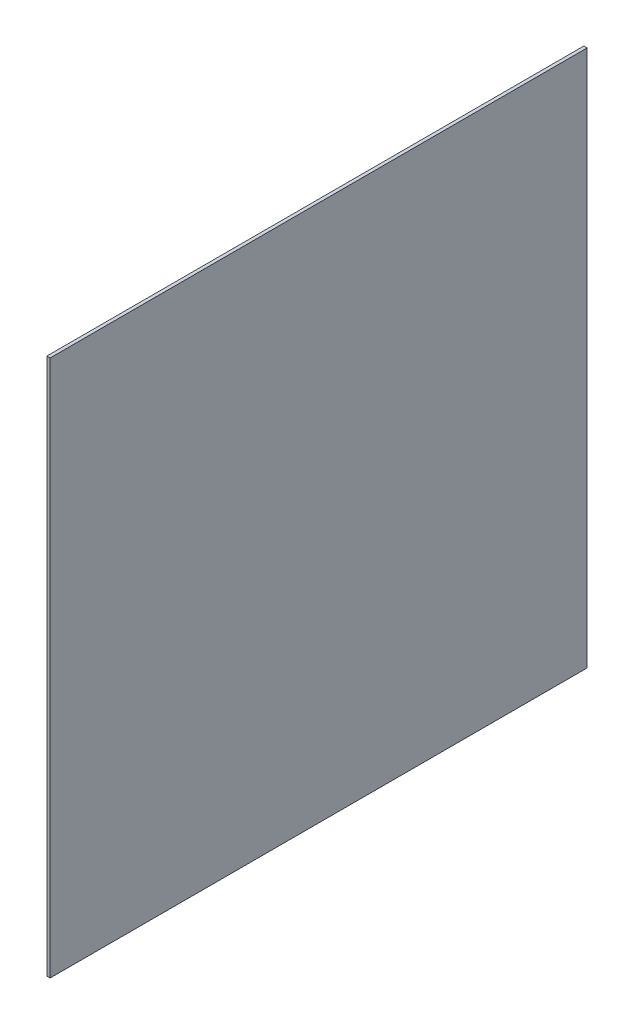
ISO-10303-21;
HEADER;
FILE_DESCRIPTION(('STEP AP214'),'2;1');
FILE_NAME('part.step','',(''),(''),'','','');
FILE_SCHEMA(('AUTOMOTIVE_DESIGN { 1 0 10303 214 1 1 1 1 }'));
ENDSEC;
DATA;
#1=APPLICATION_CONTEXT('core data for automotive mechanical design processes');
#2=APPLICATION_PROTOCOL_DEFINITION('international standard','automotive_design',2000,#1);
#3=PRODUCT_CONTEXT('',#1,'mechanical');
#4=PRODUCT('Part','Part','',(#3));
#5=PRODUCT_RELATED_PRODUCT_CATEGORY('part','',(#4));
#6=PRODUCT_DEFINITION_FORMATION('','',#4);
#7=PRODUCT_DEFINITION_CONTEXT('part definition',#1,'design');
#8=PRODUCT_DEFINITION('design','',#6,#7);
#9=PRODUCT_DEFINITION_SHAPE('','',#8);
#10=(LENGTH_UNIT() NAMED_UNIT(*) SI_UNIT(.MILLI.,.METRE.));
#11=(NAMED_UNIT(*) PLANE_ANGLE_UNIT() SI_UNIT($,.RADIAN.));
#12=(NAMED_UNIT(*) SI_UNIT($,.STERADIAN.) SOLID_ANGLE_UNIT());
#13=UNCERTAINTY_MEASURE_WITH_UNIT(LENGTH_MEASURE(1.E-05),#10,'distance_accuracy_value','');
#14=(GEOMETRIC_REPRESENTATION_CONTEXT(3) GLOBAL_UNCERTAINTY_ASSIGNED_CONTEXT((#13)) GLOBAL_UNIT_ASSIGNED_CONTEXT((#10,
#11,#12)) REPRESENTATION_CONTEXT('',''));
#15=CARTESIAN_POINT('',(0.,0.,0.));
#16=DIRECTION('',(0.,0.,1.));
#17=DIRECTION('',(1.,0.,0.));
#18=AXIS2_PLACEMENT_3D('',#15,#16,#17);
#19=CARTESIAN_POINT('',(0.8,65.4,-65.4));
#20=DIRECTION('',(0.,0.,1.));
#21=DIRECTION('',(1.,0.,0.));
#22=AXIS2_PLACEMENT_3D('',#19,#20,#21);
#23=PLANE('',#22);
#24=DIRECTION('',(0.,1.,0.));
#25=VECTOR('',#24,1.);
#26=CARTESIAN_POINT('',(0.,65.4,-65.4));
#27=LINE('',#26,#25);
#28=CARTESIAN_POINT('',(0.,-65.4,-65.4));
#29=VERTEX_POINT('',#28);
#30=CARTESIAN_POINT('',(0.,65.4,-65.4));
#31=VERTEX_POINT('',#30);
#32=EDGE_CURVE('E96',#29,#31,#27,.T.);
#33=ORIENTED_EDGE('',*,*,#32,.T.);
#34=DIRECTION('',(-1.,0.,0.));
#35=VECTOR('',#34,1.);
#36=CARTESIAN_POINT('',(0.8,65.4,-65.4));
#37=LINE('',#36,#35);
#38=CARTESIAN_POINT('',(0.8,65.4,-65.4));
#39=VERTEX_POINT('',#38);
#40=EDGE_CURVE('E11',#39,#31,#37,.T.);
#41=ORIENTED_EDGE('',*,*,#40,.F.);
#42=DIRECTION('',(0.,1.,0.));
#43=VECTOR('',#42,1.);
#44=CARTESIAN_POINT('',(0.8,65.4,-65.4));
#45=LINE('',#44,#43);
#46=CARTESIAN_POINT('',(0.8,-65.4,-65.4));
#47=VERTEX_POINT('',#46);
#48=EDGE_CURVE('E84',#47,#39,#45,.T.);
#49=ORIENTED_EDGE('',*,*,#48,.F.);
#50=DIRECTION('',(-1.,0.,0.));
#51=VECTOR('',#50,1.);
#52=CARTESIAN_POINT('',(0.8,-65.4,-65.4));
#53=LINE('',#52,#51);
#54=EDGE_CURVE('E92',#47,#29,#53,.T.);
#55=ORIENTED_EDGE('',*,*,#54,.T.);
#56=EDGE_LOOP('',(#33,#41,#49,#55));
#57=FACE_BOUND('',#56,.T.);
#58=ADVANCED_FACE('F33',(#57),#23,.F.);
#59=CARTESIAN_POINT('',(0.8,65.4,65.4));
#60=DIRECTION('',(0.,-1.,0.));
#61=DIRECTION('',(0.,0.,-1.));
#62=AXIS2_PLACEMENT_3D('',#59,#60,#61);
#63=PLANE('',#62);
#64=DIRECTION('',(0.,0.,1.));
#65=VECTOR('',#64,1.);
#66=CARTESIAN_POINT('',(0.,65.4,65.4));
#67=LINE('',#66,#65);
#68=CARTESIAN_POINT('',(0.,65.4,65.4));
#69=VERTEX_POINT('',#68);
#70=EDGE_CURVE('E88',#31,#69,#67,.T.);
#71=ORIENTED_EDGE('',*,*,#70,.T.);
#72=DIRECTION('',(-1.,0.,0.));
#73=VECTOR('',#72,1.);
#74=CARTESIAN_POINT('',(0.8,65.4,65.4));
#75=LINE('',#74,#73);
#76=CARTESIAN_POINT('',(0.8,65.4,65.4));
#77=VERTEX_POINT('',#76);
#78=EDGE_CURVE('E41',#77,#69,#75,.T.);
#79=ORIENTED_EDGE('',*,*,#78,.F.);
#80=DIRECTION('',(0.,0.,1.));
#81=VECTOR('',#80,1.);
#82=CARTESIAN_POINT('',(0.8,65.4,65.4));
#83=LINE('',#82,#81);
#84=EDGE_CURVE('E79',#39,#77,#83,.T.);
#85=ORIENTED_EDGE('',*,*,#84,.F.);
#86=ORIENTED_EDGE('',*,*,#40,.T.);
#87=EDGE_LOOP('',(#71,#79,#85,#86));
#88=FACE_BOUND('',#87,.T.);
#89=ADVANCED_FACE('F87',(#88),#63,.F.);
#90=CARTESIAN_POINT('',(0.8,65.4,65.4));
#91=DIRECTION('',(0.,0.,-1.));
#92=DIRECTION('',(0.,1.,0.));
#93=AXIS2_PLACEMENT_3D('',#90,#91,#92);
#94=PLANE('',#93);
#95=DIRECTION('',(0.,-1.,0.));
#96=VECTOR('',#95,1.);
#97=CARTESIAN_POINT('',(0.,65.4,65.4));
#98=LINE('',#97,#96);
#99=CARTESIAN_POINT('',(0.,-65.4,65.4));
#100=VERTEX_POINT('',#99);
#101=EDGE_CURVE('E66',#69,#100,#98,.T.);
#102=ORIENTED_EDGE('',*,*,#101,.T.);
#103=DIRECTION('',(-1.,0.,0.));
#104=VECTOR('',#103,1.);
#105=CARTESIAN_POINT('',(0.8,-65.4,65.4));
#106=LINE('',#105,#104);
#107=CARTESIAN_POINT('',(0.8,-65.4,65.4));
#108=VERTEX_POINT('',#107);
#109=EDGE_CURVE('E89',#108,#100,#106,.T.);
#110=ORIENTED_EDGE('',*,*,#109,.F.);
#111=DIRECTION('',(0.,-1.,0.));
#112=VECTOR('',#111,1.);
#113=CARTESIAN_POINT('',(0.8,65.4,65.4));
#114=LINE('',#113,#112);
#115=EDGE_CURVE('E82',#77,#108,#114,.T.);
#116=ORIENTED_EDGE('',*,*,#115,.F.);
#117=ORIENTED_EDGE('',*,*,#78,.T.);
#118=EDGE_LOOP('',(#102,#110,#116,#117));
#119=FACE_BOUND('',#118,.T.);
#120=ADVANCED_FACE('F90',(#119),#94,.F.);
#121=CARTESIAN_POINT('',(0.8,-65.4,65.4));
#122=DIRECTION('',(0.,1.,0.));
#123=DIRECTION('',(0.,0.,1.));
#124=AXIS2_PLACEMENT_3D('',#121,#122,#123);
#125=PLANE('',#124);
#126=DIRECTION('',(0.,0.,-1.));
#127=VECTOR('',#126,1.);
#128=CARTESIAN_POINT('',(0.,-65.4,65.4));
#129=LINE('',#128,#127);
#130=EDGE_CURVE('E72',#100,#29,#129,.T.);
#131=ORIENTED_EDGE('',*,*,#130,.T.);
#132=ORIENTED_EDGE('',*,*,#54,.F.);
#133=DIRECTION('',(0.,0.,-1.));
#134=VECTOR('',#133,1.);
#135=CARTESIAN_POINT('',(0.8,-65.4,65.4));
#136=LINE('',#135,#134);
#137=EDGE_CURVE('E49',#108,#47,#136,.T.);
#138=ORIENTED_EDGE('',*,*,#137,.F.);
#139=ORIENTED_EDGE('',*,*,#109,.T.);
#140=EDGE_LOOP('',(#131,#132,#138,#139));
#141=FACE_BOUND('',#140,.T.);
#142=ADVANCED_FACE('F103',(#141),#125,.F.);
#143=CARTESIAN_POINT('',(0.8,0.,0.));
#144=DIRECTION('',(1.,0.,0.));
#145=DIRECTION('',(0.,0.,-1.));
#146=AXIS2_PLACEMENT_3D('',#143,#144,#145);
#147=PLANE('',#146);
#148=ORIENTED_EDGE('',*,*,#48,.T.);
#149=ORIENTED_EDGE('',*,*,#84,.T.);
#150=ORIENTED_EDGE('',*,*,#115,.T.);
#151=ORIENTED_EDGE('',*,*,#137,.T.);
#152=EDGE_LOOP('',(#148,#149,#150,#151));
#153=FACE_BOUND('',#152,.T.);
#154=ADVANCED_FACE('F80',(#153),#147,.T.);
#155=CARTESIAN_POINT('',(0.,0.,0.));
#156=DIRECTION('',(1.,0.,0.));
#157=DIRECTION('',(0.,0.,-1.));
#158=AXIS2_PLACEMENT_3D('',#155,#156,#157);
#159=PLANE('',#158);
#160=ORIENTED_EDGE('',*,*,#32,.F.);
#161=ORIENTED_EDGE('',*,*,#130,.F.);
#162=ORIENTED_EDGE('',*,*,#101,.F.);
#163=ORIENTED_EDGE('',*,*,#70,.F.);
#164=EDGE_LOOP('',(#160,#161,#162,#163));
#165=FACE_BOUND('',#164,.T.);
#166=ADVANCED_FACE('F106',(#165),#159,.F.);
#167=CLOSED_SHELL('',(#58,#89,#120,#142,#154,#166));
#168=MANIFOLD_SOLID_BREP('B2',#167);
#169=ADVANCED_BREP_SHAPE_REPRESENTATION('',(#18,#168),#14);
#170=SHAPE_DEFINITION_REPRESENTATION(#9,#169);
ENDSEC;
END-ISO-10303-21;
